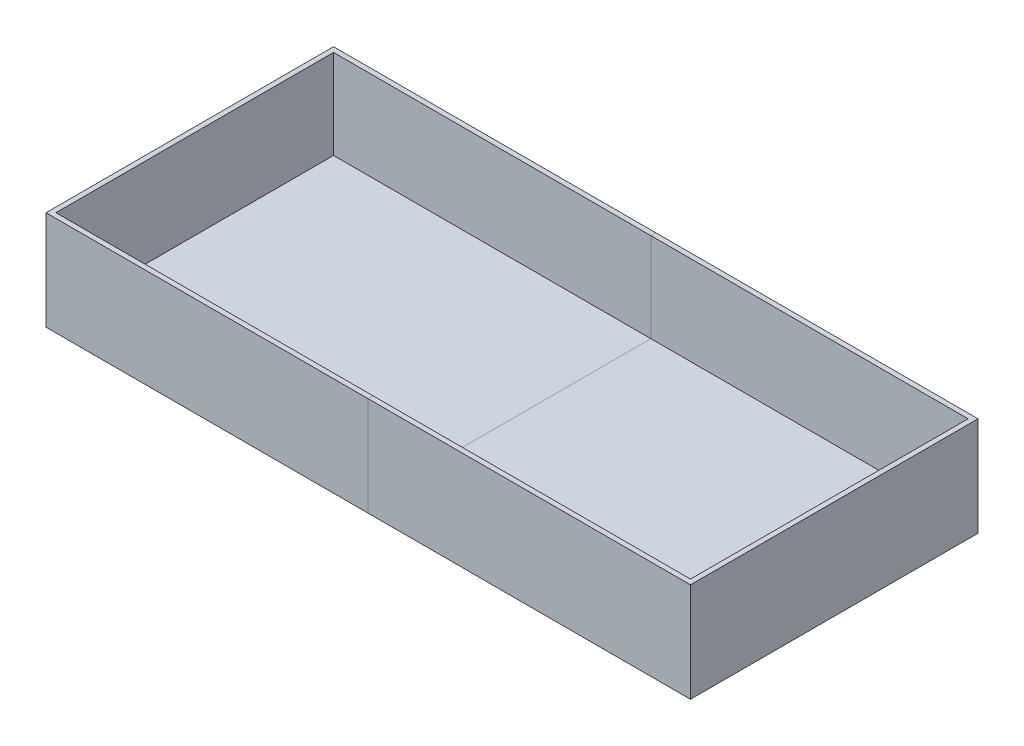
ISO-10303-21;
HEADER;
FILE_DESCRIPTION(('STEP AP214'),'2;1');
FILE_NAME('part.step','',(''),(''),'','','');
FILE_SCHEMA(('AUTOMOTIVE_DESIGN { 1 0 10303 214 1 1 1 1 }'));
ENDSEC;
DATA;
#1=APPLICATION_CONTEXT('core data for automotive mechanical design processes');
#2=APPLICATION_PROTOCOL_DEFINITION('international standard','automotive_design',2000,#1);
#3=PRODUCT_CONTEXT('',#1,'mechanical');
#4=PRODUCT('Part','Part','',(#3));
#5=PRODUCT_RELATED_PRODUCT_CATEGORY('part','',(#4));
#6=PRODUCT_DEFINITION_FORMATION('','',#4);
#7=PRODUCT_DEFINITION_CONTEXT('part definition',#1,'design');
#8=PRODUCT_DEFINITION('design','',#6,#7);
#9=PRODUCT_DEFINITION_SHAPE('','',#8);
#10=(LENGTH_UNIT() NAMED_UNIT(*) SI_UNIT(.MILLI.,.METRE.));
#11=(NAMED_UNIT(*) PLANE_ANGLE_UNIT() SI_UNIT($,.RADIAN.));
#12=(NAMED_UNIT(*) SI_UNIT($,.STERADIAN.) SOLID_ANGLE_UNIT());
#13=UNCERTAINTY_MEASURE_WITH_UNIT(LENGTH_MEASURE(1.E-05),#10,'distance_accuracy_value','');
#14=(GEOMETRIC_REPRESENTATION_CONTEXT(3) GLOBAL_UNCERTAINTY_ASSIGNED_CONTEXT((#13)) GLOBAL_UNIT_ASSIGNED_CONTEXT((#10,
#11,#12)) REPRESENTATION_CONTEXT('',''));
#15=CARTESIAN_POINT('',(0.,0.,0.));
#16=DIRECTION('',(0.,0.,1.));
#17=DIRECTION('',(1.,0.,0.));
#18=AXIS2_PLACEMENT_3D('',#15,#16,#17);
#19=CARTESIAN_POINT('',(0.,0.,0.));
#20=DIRECTION('',(1.,0.,0.));
#21=DIRECTION('',(0.,1.,0.));
#22=AXIS2_PLACEMENT_3D('',#19,#20,#21);
#23=PLANE('',#22);
#24=DIRECTION('',(0.,0.,1.));
#25=VECTOR('',#24,1.);
#26=CARTESIAN_POINT('',(0.,0.,0.));
#27=LINE('',#26,#25);
#28=CARTESIAN_POINT('',(0.,0.,-92.075));
#29=VERTEX_POINT('',#28);
#30=CARTESIAN_POINT('',(1.11022302462516E-13,0.,92.075));
#31=VERTEX_POINT('',#30);
#32=EDGE_CURVE('E153',#29,#31,#27,.T.);
#33=ORIENTED_EDGE('',*,*,#32,.F.);
#34=DIRECTION('',(0.,1.,0.));
#35=VECTOR('',#34,1.);
#36=CARTESIAN_POINT('',(0.,63.4999999999997,-92.075));
#37=LINE('',#36,#35);
#38=CARTESIAN_POINT('',(0.,63.5,-92.075));
#39=VERTEX_POINT('',#38);
#40=EDGE_CURVE('E161',#29,#39,#37,.T.);
#41=ORIENTED_EDGE('',*,*,#40,.T.);
#42=DIRECTION('',(0.,0.,1.));
#43=VECTOR('',#42,1.);
#44=CARTESIAN_POINT('',(0.,63.5,0.));
#45=LINE('',#44,#43);
#46=CARTESIAN_POINT('',(0.,63.5,-88.9));
#47=VERTEX_POINT('',#46);
#48=EDGE_CURVE('E102',#39,#47,#45,.T.);
#49=ORIENTED_EDGE('',*,*,#48,.T.);
#50=DIRECTION('',(0.,1.,0.));
#51=VECTOR('',#50,1.);
#52=CARTESIAN_POINT('',(0.,63.4999999999997,-88.9));
#53=LINE('',#52,#51);
#54=CARTESIAN_POINT('',(0.,6.35,-88.9));
#55=VERTEX_POINT('',#54);
#56=EDGE_CURVE('E150',#55,#47,#53,.T.);
#57=ORIENTED_EDGE('',*,*,#56,.F.);
#58=DIRECTION('',(0.,0.,-1.));
#59=VECTOR('',#58,1.);
#60=CARTESIAN_POINT('',(0.,6.35,0.));
#61=LINE('',#60,#59);
#62=CARTESIAN_POINT('',(0.,6.35,88.9));
#63=VERTEX_POINT('',#62);
#64=EDGE_CURVE('E113',#63,#55,#61,.T.);
#65=ORIENTED_EDGE('',*,*,#64,.F.);
#66=DIRECTION('',(0.,-1.,0.));
#67=VECTOR('',#66,1.);
#68=CARTESIAN_POINT('',(1.38777878078145E-13,63.4999999999997,88.9));
#69=LINE('',#68,#67);
#70=CARTESIAN_POINT('',(1.11022302462516E-13,63.5,88.9));
#71=VERTEX_POINT('',#70);
#72=EDGE_CURVE('E146',#71,#63,#69,.T.);
#73=ORIENTED_EDGE('',*,*,#72,.F.);
#74=CARTESIAN_POINT('',(1.11022302462516E-13,63.5,92.075));
#75=VERTEX_POINT('',#74);
#76=EDGE_CURVE('E157',#71,#75,#45,.T.);
#77=ORIENTED_EDGE('',*,*,#76,.T.);
#78=DIRECTION('',(0.,-1.,0.));
#79=VECTOR('',#78,1.);
#80=CARTESIAN_POINT('',(1.38777878078145E-13,63.4999999999997,92.075));
#81=LINE('',#80,#79);
#82=EDGE_CURVE('E164',#75,#31,#81,.T.);
#83=ORIENTED_EDGE('',*,*,#82,.T.);
#84=EDGE_LOOP('',(#33,#41,#49,#57,#65,#73,#77,#83));
#85=FACE_BOUND('',#84,.T.);
#86=ADVANCED_FACE('F55',(#85),#23,.T.);
#87=CARTESIAN_POINT('',(0.,0.,0.));
#88=DIRECTION('',(0.,-1.,0.));
#89=DIRECTION('',(0.,0.,-1.));
#90=AXIS2_PLACEMENT_3D('',#87,#88,#89);
#91=PLANE('',#90);
#92=DIRECTION('',(-1.,0.,0.));
#93=VECTOR('',#92,1.);
#94=CARTESIAN_POINT('',(-206.375,0.,-92.075));
#95=LINE('',#94,#93);
#96=CARTESIAN_POINT('',(-206.375,0.,-92.075));
#97=VERTEX_POINT('',#96);
#98=EDGE_CURVE('E80',#29,#97,#95,.T.);
#99=ORIENTED_EDGE('',*,*,#98,.F.);
#100=ORIENTED_EDGE('',*,*,#32,.T.);
#101=DIRECTION('',(1.,0.,0.));
#102=VECTOR('',#101,1.);
#103=CARTESIAN_POINT('',(-206.375,0.,92.075));
#104=LINE('',#103,#102);
#105=CARTESIAN_POINT('',(-206.375,0.,92.075));
#106=VERTEX_POINT('',#105);
#107=EDGE_CURVE('E105',#106,#31,#104,.T.);
#108=ORIENTED_EDGE('',*,*,#107,.F.);
#109=DIRECTION('',(0.,0.,1.));
#110=VECTOR('',#109,1.);
#111=CARTESIAN_POINT('',(-206.375,0.,92.075));
#112=LINE('',#111,#110);
#113=EDGE_CURVE('E125',#97,#106,#112,.T.);
#114=ORIENTED_EDGE('',*,*,#113,.F.);
#115=EDGE_LOOP('',(#99,#100,#108,#114));
#116=FACE_BOUND('',#115,.T.);
#117=ADVANCED_FACE('F218',(#116),#91,.T.);
#118=CARTESIAN_POINT('',(-206.375,63.5,92.075));
#119=DIRECTION('',(1.,0.,0.));
#120=DIRECTION('',(0.,0.,-1.));
#121=AXIS2_PLACEMENT_3D('',#118,#119,#120);
#122=PLANE('',#121);
#123=ORIENTED_EDGE('',*,*,#113,.T.);
#124=DIRECTION('',(0.,-1.,0.));
#125=VECTOR('',#124,1.);
#126=CARTESIAN_POINT('',(-206.375,63.5,92.075));
#127=LINE('',#126,#125);
#128=CARTESIAN_POINT('',(-206.375,63.5,92.075));
#129=VERTEX_POINT('',#128);
#130=EDGE_CURVE('E112',#129,#106,#127,.T.);
#131=ORIENTED_EDGE('',*,*,#130,.F.);
#132=DIRECTION('',(0.,0.,1.));
#133=VECTOR('',#132,1.);
#134=CARTESIAN_POINT('',(-206.375,63.5,92.075));
#135=LINE('',#134,#133);
#136=CARTESIAN_POINT('',(-206.375,63.5,-92.075));
#137=VERTEX_POINT('',#136);
#138=EDGE_CURVE('E98',#137,#129,#135,.T.);
#139=ORIENTED_EDGE('',*,*,#138,.F.);
#140=DIRECTION('',(0.,-1.,0.));
#141=VECTOR('',#140,1.);
#142=CARTESIAN_POINT('',(-206.375,63.5,-92.075));
#143=LINE('',#142,#141);
#144=EDGE_CURVE('E107',#137,#97,#143,.T.);
#145=ORIENTED_EDGE('',*,*,#144,.T.);
#146=EDGE_LOOP('',(#123,#131,#139,#145));
#147=FACE_BOUND('',#146,.T.);
#148=ADVANCED_FACE('F115',(#147),#122,.F.);
#149=CARTESIAN_POINT('',(0.,63.5,0.));
#150=DIRECTION('',(0.,-1.,0.));
#151=DIRECTION('',(0.,0.,-1.));
#152=AXIS2_PLACEMENT_3D('',#149,#150,#151);
#153=PLANE('',#152);
#154=ORIENTED_EDGE('',*,*,#48,.F.);
#155=DIRECTION('',(-1.,0.,0.));
#156=VECTOR('',#155,1.);
#157=CARTESIAN_POINT('',(-206.375,63.5,-92.075));
#158=LINE('',#157,#156);
#159=EDGE_CURVE('E94',#39,#137,#158,.T.);
#160=ORIENTED_EDGE('',*,*,#159,.T.);
#161=ORIENTED_EDGE('',*,*,#138,.T.);
#162=DIRECTION('',(1.,0.,0.));
#163=VECTOR('',#162,1.);
#164=CARTESIAN_POINT('',(-206.375,63.5,92.075));
#165=LINE('',#164,#163);
#166=EDGE_CURVE('E119',#129,#75,#165,.T.);
#167=ORIENTED_EDGE('',*,*,#166,.T.);
#168=ORIENTED_EDGE('',*,*,#76,.F.);
#169=DIRECTION('',(1.,0.,0.));
#170=VECTOR('',#169,1.);
#171=CARTESIAN_POINT('',(-203.2,63.5,88.9));
#172=LINE('',#171,#170);
#173=CARTESIAN_POINT('',(-203.2,63.5,88.9));
#174=VERTEX_POINT('',#173);
#175=EDGE_CURVE('E134',#174,#71,#172,.T.);
#176=ORIENTED_EDGE('',*,*,#175,.F.);
#177=DIRECTION('',(0.,0.,1.));
#178=VECTOR('',#177,1.);
#179=CARTESIAN_POINT('',(-203.2,63.5,88.9));
#180=LINE('',#179,#178);
#181=CARTESIAN_POINT('',(-203.2,63.5,-88.9));
#182=VERTEX_POINT('',#181);
#183=EDGE_CURVE('E135',#182,#174,#180,.T.);
#184=ORIENTED_EDGE('',*,*,#183,.F.);
#185=DIRECTION('',(-1.,0.,0.));
#186=VECTOR('',#185,1.);
#187=CARTESIAN_POINT('',(-203.2,63.5,-88.9));
#188=LINE('',#187,#186);
#189=EDGE_CURVE('E71',#47,#182,#188,.T.);
#190=ORIENTED_EDGE('',*,*,#189,.F.);
#191=EDGE_LOOP('',(#154,#160,#161,#167,#168,#176,#184,#190));
#192=FACE_BOUND('',#191,.T.);
#193=ADVANCED_FACE('F95',(#192),#153,.F.);
#194=CARTESIAN_POINT('',(-203.2,63.5,88.9));
#195=DIRECTION('',(1.,0.,0.));
#196=DIRECTION('',(0.,0.,-1.));
#197=AXIS2_PLACEMENT_3D('',#194,#195,#196);
#198=PLANE('',#197);
#199=DIRECTION('',(0.,0.,-1.));
#200=VECTOR('',#199,1.);
#201=CARTESIAN_POINT('',(-203.2,6.35,0.));
#202=LINE('',#201,#200);
#203=CARTESIAN_POINT('',(-203.2,6.35,88.9));
#204=VERTEX_POINT('',#203);
#205=CARTESIAN_POINT('',(-203.2,6.35,-88.9));
#206=VERTEX_POINT('',#205);
#207=EDGE_CURVE('E139',#204,#206,#202,.T.);
#208=ORIENTED_EDGE('',*,*,#207,.T.);
#209=DIRECTION('',(0.,-1.,0.));
#210=VECTOR('',#209,1.);
#211=CARTESIAN_POINT('',(-203.2,63.5,-88.9));
#212=LINE('',#211,#210);
#213=EDGE_CURVE('E127',#182,#206,#212,.T.);
#214=ORIENTED_EDGE('',*,*,#213,.F.);
#215=ORIENTED_EDGE('',*,*,#183,.T.);
#216=DIRECTION('',(0.,-1.,0.));
#217=VECTOR('',#216,1.);
#218=CARTESIAN_POINT('',(-203.2,63.5,88.9));
#219=LINE('',#218,#217);
#220=EDGE_CURVE('E130',#174,#204,#219,.T.);
#221=ORIENTED_EDGE('',*,*,#220,.T.);
#222=EDGE_LOOP('',(#208,#214,#215,#221));
#223=FACE_BOUND('',#222,.T.);
#224=ADVANCED_FACE('F202',(#223),#198,.T.);
#225=CARTESIAN_POINT('',(-203.2,63.5,-88.9));
#226=DIRECTION('',(0.,0.,1.));
#227=DIRECTION('',(1.,0.,0.));
#228=AXIS2_PLACEMENT_3D('',#225,#226,#227);
#229=PLANE('',#228);
#230=DIRECTION('',(1.,0.,0.));
#231=VECTOR('',#230,1.);
#232=CARTESIAN_POINT('',(0.,6.35,-88.9));
#233=LINE('',#232,#231);
#234=EDGE_CURVE('E64',#206,#55,#233,.T.);
#235=ORIENTED_EDGE('',*,*,#234,.T.);
#236=ORIENTED_EDGE('',*,*,#56,.T.);
#237=ORIENTED_EDGE('',*,*,#189,.T.);
#238=ORIENTED_EDGE('',*,*,#213,.T.);
#239=EDGE_LOOP('',(#235,#236,#237,#238));
#240=FACE_BOUND('',#239,.T.);
#241=ADVANCED_FACE('F181',(#240),#229,.T.);
#242=CARTESIAN_POINT('',(-203.2,63.5,88.9));
#243=DIRECTION('',(0.,0.,-1.));
#244=DIRECTION('',(-1.,0.,0.));
#245=AXIS2_PLACEMENT_3D('',#242,#243,#244);
#246=PLANE('',#245);
#247=ORIENTED_EDGE('',*,*,#175,.T.);
#248=ORIENTED_EDGE('',*,*,#72,.T.);
#249=DIRECTION('',(1.,0.,0.));
#250=VECTOR('',#249,1.);
#251=CARTESIAN_POINT('',(0.,6.35,88.9));
#252=LINE('',#251,#250);
#253=EDGE_CURVE('E12',#204,#63,#252,.T.);
#254=ORIENTED_EDGE('',*,*,#253,.F.);
#255=ORIENTED_EDGE('',*,*,#220,.F.);
#256=EDGE_LOOP('',(#247,#248,#254,#255));
#257=FACE_BOUND('',#256,.T.);
#258=ADVANCED_FACE('F199',(#257),#246,.T.);
#259=CARTESIAN_POINT('',(0.,6.35,0.));
#260=DIRECTION('',(0.,1.,0.));
#261=DIRECTION('',(0.,0.,1.));
#262=AXIS2_PLACEMENT_3D('',#259,#260,#261);
#263=PLANE('',#262);
#264=ORIENTED_EDGE('',*,*,#253,.T.);
#265=ORIENTED_EDGE('',*,*,#64,.T.);
#266=ORIENTED_EDGE('',*,*,#234,.F.);
#267=ORIENTED_EDGE('',*,*,#207,.F.);
#268=EDGE_LOOP('',(#264,#265,#266,#267));
#269=FACE_BOUND('',#268,.T.);
#270=ADVANCED_FACE('F57',(#269),#263,.T.);
#271=CARTESIAN_POINT('',(-206.375,63.5,92.075));
#272=DIRECTION('',(0.,0.,-1.));
#273=DIRECTION('',(-1.,0.,0.));
#274=AXIS2_PLACEMENT_3D('',#271,#272,#273);
#275=PLANE('',#274);
#276=ORIENTED_EDGE('',*,*,#82,.F.);
#277=ORIENTED_EDGE('',*,*,#166,.F.);
#278=ORIENTED_EDGE('',*,*,#130,.T.);
#279=ORIENTED_EDGE('',*,*,#107,.T.);
#280=EDGE_LOOP('',(#276,#277,#278,#279));
#281=FACE_BOUND('',#280,.T.);
#282=ADVANCED_FACE('F214',(#281),#275,.F.);
#283=CARTESIAN_POINT('',(-206.375,63.5,-92.075));
#284=DIRECTION('',(0.,0.,1.));
#285=DIRECTION('',(1.,0.,0.));
#286=AXIS2_PLACEMENT_3D('',#283,#284,#285);
#287=PLANE('',#286);
#288=ORIENTED_EDGE('',*,*,#40,.F.);
#289=ORIENTED_EDGE('',*,*,#98,.T.);
#290=ORIENTED_EDGE('',*,*,#144,.F.);
#291=ORIENTED_EDGE('',*,*,#159,.F.);
#292=EDGE_LOOP('',(#288,#289,#290,#291));
#293=FACE_BOUND('',#292,.T.);
#294=ADVANCED_FACE('F108',(#293),#287,.F.);
#295=CLOSED_SHELL('',(#86,#117,#148,#193,#224,#241,#258,#270,#282,#294));
#296=MANIFOLD_SOLID_BREP('B2',#295);
#297=CARTESIAN_POINT('',(0.,0.,0.));
#298=DIRECTION('',(1.,0.,0.));
#299=DIRECTION('',(0.,1.,0.));
#300=AXIS2_PLACEMENT_3D('',#297,#298,#299);
#301=PLANE('',#300);
#302=DIRECTION('',(0.,0.,1.));
#303=VECTOR('',#302,1.);
#304=CARTESIAN_POINT('',(0.,0.,0.));
#305=LINE('',#304,#303);
#306=CARTESIAN_POINT('',(0.,0.,-92.075));
#307=VERTEX_POINT('',#306);
#308=CARTESIAN_POINT('',(1.11022302462516E-13,0.,92.075));
#309=VERTEX_POINT('',#308);
#310=EDGE_CURVE('E310',#307,#309,#305,.T.);
#311=ORIENTED_EDGE('',*,*,#310,.T.);
#312=DIRECTION('',(0.,-1.,0.));
#313=VECTOR('',#312,1.);
#314=CARTESIAN_POINT('',(1.38777878078145E-13,63.4999999999997,92.075));
#315=LINE('',#314,#313);
#316=CARTESIAN_POINT('',(1.11022302462516E-13,63.5,92.075));
#317=VERTEX_POINT('',#316);
#318=EDGE_CURVE('E421',#317,#309,#315,.T.);
#319=ORIENTED_EDGE('',*,*,#318,.F.);
#320=DIRECTION('',(0.,0.,1.));
#321=VECTOR('',#320,1.);
#322=CARTESIAN_POINT('',(0.,63.5,0.));
#323=LINE('',#322,#321);
#324=CARTESIAN_POINT('',(1.11022302462516E-13,63.5,88.9));
#325=VERTEX_POINT('',#324);
#326=EDGE_CURVE('E427',#325,#317,#323,.T.);
#327=ORIENTED_EDGE('',*,*,#326,.F.);
#328=DIRECTION('',(0.,-1.,0.));
#329=VECTOR('',#328,1.);
#330=CARTESIAN_POINT('',(1.38777878078145E-13,63.4999999999997,88.9));
#331=LINE('',#330,#329);
#332=CARTESIAN_POINT('',(0.,6.35,88.9));
#333=VERTEX_POINT('',#332);
#334=EDGE_CURVE('E315',#325,#333,#331,.T.);
#335=ORIENTED_EDGE('',*,*,#334,.T.);
#336=DIRECTION('',(0.,0.,-1.));
#337=VECTOR('',#336,1.);
#338=CARTESIAN_POINT('',(0.,6.35,0.));
#339=LINE('',#338,#337);
#340=CARTESIAN_POINT('',(0.,6.35,-88.9));
#341=VERTEX_POINT('',#340);
#342=EDGE_CURVE('E53',#333,#341,#339,.T.);
#343=ORIENTED_EDGE('',*,*,#342,.T.);
#344=DIRECTION('',(0.,1.,0.));
#345=VECTOR('',#344,1.);
#346=CARTESIAN_POINT('',(0.,63.4999999999997,-88.9));
#347=LINE('',#346,#345);
#348=CARTESIAN_POINT('',(0.,63.5,-88.9));
#349=VERTEX_POINT('',#348);
#350=EDGE_CURVE('E329',#341,#349,#347,.T.);
#351=ORIENTED_EDGE('',*,*,#350,.T.);
#352=CARTESIAN_POINT('',(0.,63.5,-92.075));
#353=VERTEX_POINT('',#352);
#354=EDGE_CURVE('E425',#353,#349,#323,.T.);
#355=ORIENTED_EDGE('',*,*,#354,.F.);
#356=DIRECTION('',(0.,1.,0.));
#357=VECTOR('',#356,1.);
#358=CARTESIAN_POINT('',(0.,63.4999999999997,-92.075));
#359=LINE('',#358,#357);
#360=EDGE_CURVE('E428',#307,#353,#359,.T.);
#361=ORIENTED_EDGE('',*,*,#360,.F.);
#362=EDGE_LOOP('',(#311,#319,#327,#335,#343,#351,#355,#361));
#363=FACE_BOUND('',#362,.T.);
#364=ADVANCED_FACE('F307',(#363),#301,.F.);
#365=CARTESIAN_POINT('',(0.,63.5,0.));
#366=DIRECTION('',(0.,-1.,0.));
#367=DIRECTION('',(0.,0.,-1.));
#368=AXIS2_PLACEMENT_3D('',#365,#366,#367);
#369=PLANE('',#368);
#370=DIRECTION('',(-1.,0.,0.));
#371=VECTOR('',#370,1.);
#372=CARTESIAN_POINT('',(-206.375,63.5,-92.075));
#373=LINE('',#372,#371);
#374=CARTESIAN_POINT('',(206.375,63.5,-92.075));
#375=VERTEX_POINT('',#374);
#376=EDGE_CURVE('E404',#375,#353,#373,.T.);
#377=ORIENTED_EDGE('',*,*,#376,.T.);
#378=ORIENTED_EDGE('',*,*,#354,.T.);
#379=DIRECTION('',(-1.,0.,0.));
#380=VECTOR('',#379,1.);
#381=CARTESIAN_POINT('',(-203.2,63.5,-88.9));
#382=LINE('',#381,#380);
#383=CARTESIAN_POINT('',(203.2,63.5,-88.9));
#384=VERTEX_POINT('',#383);
#385=EDGE_CURVE('E396',#384,#349,#382,.T.);
#386=ORIENTED_EDGE('',*,*,#385,.F.);
#387=DIRECTION('',(0.,0.,-1.));
#388=VECTOR('',#387,1.);
#389=CARTESIAN_POINT('',(203.2,63.5,88.9));
#390=LINE('',#389,#388);
#391=CARTESIAN_POINT('',(203.2,63.5,88.9));
#392=VERTEX_POINT('',#391);
#393=EDGE_CURVE('E392',#392,#384,#390,.T.);
#394=ORIENTED_EDGE('',*,*,#393,.F.);
#395=DIRECTION('',(1.,0.,0.));
#396=VECTOR('',#395,1.);
#397=CARTESIAN_POINT('',(-203.2,63.5,88.9));
#398=LINE('',#397,#396);
#399=EDGE_CURVE('E382',#325,#392,#398,.T.);
#400=ORIENTED_EDGE('',*,*,#399,.F.);
#401=ORIENTED_EDGE('',*,*,#326,.T.);
#402=DIRECTION('',(1.,0.,0.));
#403=VECTOR('',#402,1.);
#404=CARTESIAN_POINT('',(-206.375,63.5,92.075));
#405=LINE('',#404,#403);
#406=CARTESIAN_POINT('',(206.375,63.5,92.075));
#407=VERTEX_POINT('',#406);
#408=EDGE_CURVE('E408',#317,#407,#405,.T.);
#409=ORIENTED_EDGE('',*,*,#408,.T.);
#410=DIRECTION('',(0.,0.,-1.));
#411=VECTOR('',#410,1.);
#412=CARTESIAN_POINT('',(206.375,63.5,92.075));
#413=LINE('',#412,#411);
#414=EDGE_CURVE('E401',#407,#375,#413,.T.);
#415=ORIENTED_EDGE('',*,*,#414,.T.);
#416=EDGE_LOOP('',(#377,#378,#386,#394,#400,#401,#409,#415));
#417=FACE_BOUND('',#416,.T.);
#418=ADVANCED_FACE('F434',(#417),#369,.F.);
#419=CARTESIAN_POINT('',(0.,0.,0.));
#420=DIRECTION('',(0.,-1.,0.));
#421=DIRECTION('',(0.,0.,-1.));
#422=AXIS2_PLACEMENT_3D('',#419,#420,#421);
#423=PLANE('',#422);
#424=ORIENTED_EDGE('',*,*,#310,.F.);
#425=DIRECTION('',(-1.,0.,0.));
#426=VECTOR('',#425,1.);
#427=CARTESIAN_POINT('',(-206.375,0.,-92.075));
#428=LINE('',#427,#426);
#429=CARTESIAN_POINT('',(206.375,0.,-92.075));
#430=VERTEX_POINT('',#429);
#431=EDGE_CURVE('E413',#430,#307,#428,.T.);
#432=ORIENTED_EDGE('',*,*,#431,.F.);
#433=DIRECTION('',(0.,0.,-1.));
#434=VECTOR('',#433,1.);
#435=CARTESIAN_POINT('',(206.375,0.,92.075));
#436=LINE('',#435,#434);
#437=CARTESIAN_POINT('',(206.375,0.,92.075));
#438=VERTEX_POINT('',#437);
#439=EDGE_CURVE('E400',#438,#430,#436,.T.);
#440=ORIENTED_EDGE('',*,*,#439,.F.);
#441=DIRECTION('',(1.,0.,0.));
#442=VECTOR('',#441,1.);
#443=CARTESIAN_POINT('',(-206.375,0.,92.075));
#444=LINE('',#443,#442);
#445=EDGE_CURVE('E405',#309,#438,#444,.T.);
#446=ORIENTED_EDGE('',*,*,#445,.F.);
#447=EDGE_LOOP('',(#424,#432,#440,#446));
#448=FACE_BOUND('',#447,.T.);
#449=ADVANCED_FACE('F451',(#448),#423,.T.);
#450=CARTESIAN_POINT('',(206.375,63.5,92.075));
#451=DIRECTION('',(-1.,0.,0.));
#452=DIRECTION('',(0.,0.,1.));
#453=AXIS2_PLACEMENT_3D('',#450,#451,#452);
#454=PLANE('',#453);
#455=ORIENTED_EDGE('',*,*,#439,.T.);
#456=DIRECTION('',(0.,-1.,0.));
#457=VECTOR('',#456,1.);
#458=CARTESIAN_POINT('',(206.375,63.5,-92.075));
#459=LINE('',#458,#457);
#460=EDGE_CURVE('E419',#375,#430,#459,.T.);
#461=ORIENTED_EDGE('',*,*,#460,.F.);
#462=ORIENTED_EDGE('',*,*,#414,.F.);
#463=DIRECTION('',(0.,-1.,0.));
#464=VECTOR('',#463,1.);
#465=CARTESIAN_POINT('',(206.375,63.5,92.075));
#466=LINE('',#465,#464);
#467=EDGE_CURVE('E410',#407,#438,#466,.T.);
#468=ORIENTED_EDGE('',*,*,#467,.T.);
#469=EDGE_LOOP('',(#455,#461,#462,#468));
#470=FACE_BOUND('',#469,.T.);
#471=ADVANCED_FACE('F447',(#470),#454,.F.);
#472=CARTESIAN_POINT('',(-206.375,63.5,-92.075));
#473=DIRECTION('',(0.,0.,1.));
#474=DIRECTION('',(1.,0.,0.));
#475=AXIS2_PLACEMENT_3D('',#472,#473,#474);
#476=PLANE('',#475);
#477=ORIENTED_EDGE('',*,*,#431,.T.);
#478=ORIENTED_EDGE('',*,*,#360,.T.);
#479=ORIENTED_EDGE('',*,*,#376,.F.);
#480=ORIENTED_EDGE('',*,*,#460,.T.);
#481=EDGE_LOOP('',(#477,#478,#479,#480));
#482=FACE_BOUND('',#481,.T.);
#483=ADVANCED_FACE('F449',(#482),#476,.F.);
#484=CARTESIAN_POINT('',(-206.375,63.5,92.075));
#485=DIRECTION('',(0.,0.,-1.));
#486=DIRECTION('',(-1.,0.,0.));
#487=AXIS2_PLACEMENT_3D('',#484,#485,#486);
#488=PLANE('',#487);
#489=ORIENTED_EDGE('',*,*,#408,.F.);
#490=ORIENTED_EDGE('',*,*,#318,.T.);
#491=ORIENTED_EDGE('',*,*,#445,.T.);
#492=ORIENTED_EDGE('',*,*,#467,.F.);
#493=EDGE_LOOP('',(#489,#490,#491,#492));
#494=FACE_BOUND('',#493,.T.);
#495=ADVANCED_FACE('F442',(#494),#488,.F.);
#496=CARTESIAN_POINT('',(203.2,63.5,88.9));
#497=DIRECTION('',(-1.,0.,0.));
#498=DIRECTION('',(0.,0.,1.));
#499=AXIS2_PLACEMENT_3D('',#496,#497,#498);
#500=PLANE('',#499);
#501=DIRECTION('',(0.,0.,-1.));
#502=VECTOR('',#501,1.);
#503=CARTESIAN_POINT('',(203.2,6.35,0.));
#504=LINE('',#503,#502);
#505=CARTESIAN_POINT('',(203.2,6.35,88.9));
#506=VERTEX_POINT('',#505);
#507=CARTESIAN_POINT('',(203.2,6.35,-88.9));
#508=VERTEX_POINT('',#507);
#509=EDGE_CURVE('E375',#506,#508,#504,.T.);
#510=ORIENTED_EDGE('',*,*,#509,.F.);
#511=DIRECTION('',(0.,-1.,0.));
#512=VECTOR('',#511,1.);
#513=CARTESIAN_POINT('',(203.2,63.5,88.9));
#514=LINE('',#513,#512);
#515=EDGE_CURVE('E379',#392,#506,#514,.T.);
#516=ORIENTED_EDGE('',*,*,#515,.F.);
#517=ORIENTED_EDGE('',*,*,#393,.T.);
#518=DIRECTION('',(0.,-1.,0.));
#519=VECTOR('',#518,1.);
#520=CARTESIAN_POINT('',(203.2,63.5,-88.9));
#521=LINE('',#520,#519);
#522=EDGE_CURVE('E385',#384,#508,#521,.T.);
#523=ORIENTED_EDGE('',*,*,#522,.T.);
#524=EDGE_LOOP('',(#510,#516,#517,#523));
#525=FACE_BOUND('',#524,.T.);
#526=ADVANCED_FACE('F388',(#525),#500,.T.);
#527=CARTESIAN_POINT('',(-203.2,63.5,-88.9));
#528=DIRECTION('',(0.,0.,1.));
#529=DIRECTION('',(1.,0.,0.));
#530=AXIS2_PLACEMENT_3D('',#527,#528,#529);
#531=PLANE('',#530);
#532=ORIENTED_EDGE('',*,*,#350,.F.);
#533=DIRECTION('',(1.,0.,0.));
#534=VECTOR('',#533,1.);
#535=CARTESIAN_POINT('',(0.,6.35,-88.9));
#536=LINE('',#535,#534);
#537=EDGE_CURVE('E390',#341,#508,#536,.T.);
#538=ORIENTED_EDGE('',*,*,#537,.T.);
#539=ORIENTED_EDGE('',*,*,#522,.F.);
#540=ORIENTED_EDGE('',*,*,#385,.T.);
#541=EDGE_LOOP('',(#532,#538,#539,#540));
#542=FACE_BOUND('',#541,.T.);
#543=ADVANCED_FACE('F470',(#542),#531,.T.);
#544=CARTESIAN_POINT('',(-203.2,63.5,88.9));
#545=DIRECTION('',(0.,0.,-1.));
#546=DIRECTION('',(-1.,0.,0.));
#547=AXIS2_PLACEMENT_3D('',#544,#545,#546);
#548=PLANE('',#547);
#549=ORIENTED_EDGE('',*,*,#334,.F.);
#550=ORIENTED_EDGE('',*,*,#399,.T.);
#551=ORIENTED_EDGE('',*,*,#515,.T.);
#552=DIRECTION('',(1.,0.,0.));
#553=VECTOR('',#552,1.);
#554=CARTESIAN_POINT('',(0.,6.35,88.9));
#555=LINE('',#554,#553);
#556=EDGE_CURVE('E371',#333,#506,#555,.T.);
#557=ORIENTED_EDGE('',*,*,#556,.F.);
#558=EDGE_LOOP('',(#549,#550,#551,#557));
#559=FACE_BOUND('',#558,.T.);
#560=ADVANCED_FACE('F380',(#559),#548,.T.);
#561=CARTESIAN_POINT('',(0.,6.35,0.));
#562=DIRECTION('',(0.,1.,0.));
#563=DIRECTION('',(0.,0.,1.));
#564=AXIS2_PLACEMENT_3D('',#561,#562,#563);
#565=PLANE('',#564);
#566=ORIENTED_EDGE('',*,*,#342,.F.);
#567=ORIENTED_EDGE('',*,*,#556,.T.);
#568=ORIENTED_EDGE('',*,*,#509,.T.);
#569=ORIENTED_EDGE('',*,*,#537,.F.);
#570=EDGE_LOOP('',(#566,#567,#568,#569));
#571=FACE_BOUND('',#570,.T.);
#572=ADVANCED_FACE('F373',(#571),#565,.T.);
#573=CLOSED_SHELL('',(#364,#418,#449,#471,#483,#495,#526,#543,#560,#572));
#574=MANIFOLD_SOLID_BREP('B6',#573);
#575=ADVANCED_BREP_SHAPE_REPRESENTATION('',(#18,#296,#574),#14);
#576=SHAPE_DEFINITION_REPRESENTATION(#9,#575);
ENDSEC;
END-ISO-10303-21;
